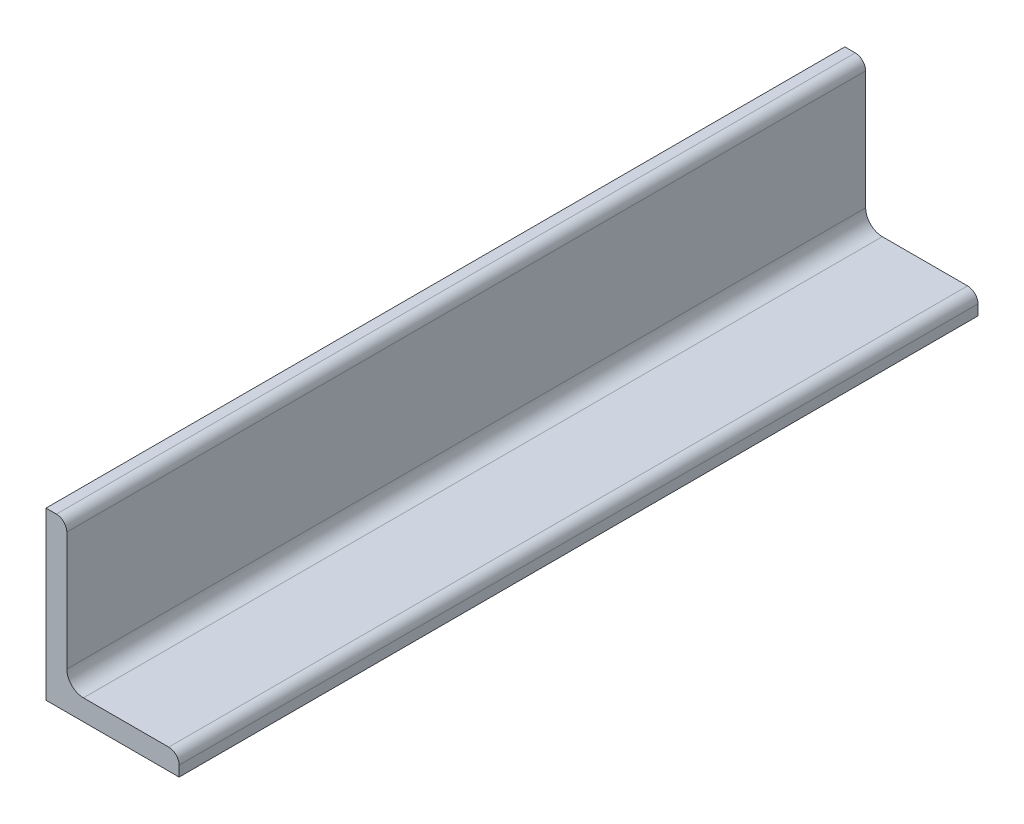
ISO-10303-21;
HEADER;
FILE_DESCRIPTION(('STEP AP214'),'2;1');
FILE_NAME('part.step','',(''),(''),'','','');
FILE_SCHEMA(('AUTOMOTIVE_DESIGN { 1 0 10303 214 1 1 1 1 }'));
ENDSEC;
DATA;
#1=APPLICATION_CONTEXT('core data for automotive mechanical design processes');
#2=APPLICATION_PROTOCOL_DEFINITION('international standard','automotive_design',2000,#1);
#3=PRODUCT_CONTEXT('',#1,'mechanical');
#4=PRODUCT('Part','Part','',(#3));
#5=PRODUCT_RELATED_PRODUCT_CATEGORY('part','',(#4));
#6=PRODUCT_DEFINITION_FORMATION('','',#4);
#7=PRODUCT_DEFINITION_CONTEXT('part definition',#1,'design');
#8=PRODUCT_DEFINITION('design','',#6,#7);
#9=PRODUCT_DEFINITION_SHAPE('','',#8);
#10=(LENGTH_UNIT() NAMED_UNIT(*) SI_UNIT(.MILLI.,.METRE.));
#11=(NAMED_UNIT(*) PLANE_ANGLE_UNIT() SI_UNIT($,.RADIAN.));
#12=(NAMED_UNIT(*) SI_UNIT($,.STERADIAN.) SOLID_ANGLE_UNIT());
#13=UNCERTAINTY_MEASURE_WITH_UNIT(LENGTH_MEASURE(1.E-05),#10,'distance_accuracy_value','');
#14=(GEOMETRIC_REPRESENTATION_CONTEXT(3) GLOBAL_UNCERTAINTY_ASSIGNED_CONTEXT((#13)) GLOBAL_UNIT_ASSIGNED_CONTEXT((#10,
#11,#12)) REPRESENTATION_CONTEXT('',''));
#15=CARTESIAN_POINT('',(0.,0.,0.));
#16=DIRECTION('',(0.,0.,1.));
#17=DIRECTION('',(1.,0.,0.));
#18=AXIS2_PLACEMENT_3D('',#15,#16,#17);
#19=CARTESIAN_POINT('',(0.116507760447575,63.8534276781816,304.8));
#20=DIRECTION('',(1.,0.,0.));
#21=DIRECTION('',(0.,0.,-1.));
#22=AXIS2_PLACEMENT_3D('',#19,#20,#21);
#23=PLANE('',#22);
#24=DIRECTION('',(0.,-1.,0.));
#25=VECTOR('',#24,1.);
#26=CARTESIAN_POINT('',(0.116507760447575,63.8534276781816,0.));
#27=LINE('',#26,#25);
#28=CARTESIAN_POINT('',(0.116507760447575,63.8534276781816,0.));
#29=VERTEX_POINT('',#28);
#30=CARTESIAN_POINT('',(0.116507760447575,0.353427678181561,0.));
#31=VERTEX_POINT('',#30);
#32=EDGE_CURVE('E135',#29,#31,#27,.T.);
#33=ORIENTED_EDGE('',*,*,#32,.T.);
#34=DIRECTION('',(0.,0.,-1.));
#35=VECTOR('',#34,1.);
#36=CARTESIAN_POINT('',(0.116507760447575,0.353427678181561,304.8));
#37=LINE('',#36,#35);
#38=CARTESIAN_POINT('',(0.116507760447575,0.353427678181561,304.8));
#39=VERTEX_POINT('',#38);
#40=EDGE_CURVE('E11',#39,#31,#37,.T.);
#41=ORIENTED_EDGE('',*,*,#40,.F.);
#42=DIRECTION('',(0.,-1.,0.));
#43=VECTOR('',#42,1.);
#44=CARTESIAN_POINT('',(0.116507760447575,63.8534276781816,304.8));
#45=LINE('',#44,#43);
#46=CARTESIAN_POINT('',(0.116507760447575,63.8534276781816,304.8));
#47=VERTEX_POINT('',#46);
#48=EDGE_CURVE('E151',#47,#39,#45,.T.);
#49=ORIENTED_EDGE('',*,*,#48,.F.);
#50=DIRECTION('',(0.,0.,-1.));
#51=VECTOR('',#50,1.);
#52=CARTESIAN_POINT('',(0.116507760447575,63.8534276781816,304.8));
#53=LINE('',#52,#51);
#54=EDGE_CURVE('E131',#47,#29,#53,.T.);
#55=ORIENTED_EDGE('',*,*,#54,.T.);
#56=EDGE_LOOP('',(#33,#41,#49,#55));
#57=FACE_BOUND('',#56,.T.);
#58=ADVANCED_FACE('F33',(#57),#23,.F.);
#59=CARTESIAN_POINT('',(0.116507760447575,0.353427678181561,304.8));
#60=DIRECTION('',(0.,1.,0.));
#61=DIRECTION('',(0.,0.,1.));
#62=AXIS2_PLACEMENT_3D('',#59,#60,#61);
#63=PLANE('',#62);
#64=DIRECTION('',(1.,0.,0.));
#65=VECTOR('',#64,1.);
#66=CARTESIAN_POINT('',(0.116507760447575,0.353427678181561,0.));
#67=LINE('',#66,#65);
#68=CARTESIAN_POINT('',(50.9165077604476,0.353427678181561,0.));
#69=VERTEX_POINT('',#68);
#70=EDGE_CURVE('E138',#31,#69,#67,.T.);
#71=ORIENTED_EDGE('',*,*,#70,.T.);
#72=DIRECTION('',(0.,0.,-1.));
#73=VECTOR('',#72,1.);
#74=CARTESIAN_POINT('',(50.9165077604476,0.353427678181561,304.8));
#75=LINE('',#74,#73);
#76=CARTESIAN_POINT('',(50.9165077604476,0.353427678181561,304.8));
#77=VERTEX_POINT('',#76);
#78=EDGE_CURVE('E41',#77,#69,#75,.T.);
#79=ORIENTED_EDGE('',*,*,#78,.F.);
#80=DIRECTION('',(1.,0.,0.));
#81=VECTOR('',#80,1.);
#82=CARTESIAN_POINT('',(0.116507760447575,0.353427678181561,304.8));
#83=LINE('',#82,#81);
#84=EDGE_CURVE('E95',#39,#77,#83,.T.);
#85=ORIENTED_EDGE('',*,*,#84,.F.);
#86=ORIENTED_EDGE('',*,*,#40,.T.);
#87=EDGE_LOOP('',(#71,#79,#85,#86));
#88=FACE_BOUND('',#87,.T.);
#89=ADVANCED_FACE('F194',(#88),#63,.F.);
#90=CARTESIAN_POINT('',(50.9165077604476,0.353427678181561,304.8));
#91=DIRECTION('',(-1.,0.,0.));
#92=DIRECTION('',(0.,0.,1.));
#93=AXIS2_PLACEMENT_3D('',#90,#91,#92);
#94=PLANE('',#93);
#95=DIRECTION('',(0.,1.,0.));
#96=VECTOR('',#95,1.);
#97=CARTESIAN_POINT('',(50.9165077604476,0.353427678181561,0.));
#98=LINE('',#97,#96);
#99=CARTESIAN_POINT('',(50.9165077604476,4.32217767818156,0.));
#100=VERTEX_POINT('',#99);
#101=EDGE_CURVE('E140',#69,#100,#98,.T.);
#102=ORIENTED_EDGE('',*,*,#101,.T.);
#103=DIRECTION('',(0.,0.,-1.));
#104=VECTOR('',#103,1.);
#105=CARTESIAN_POINT('',(50.9165077604476,4.32217767818156,304.8));
#106=LINE('',#105,#104);
#107=CARTESIAN_POINT('',(50.9165077604476,4.32217767818156,304.8));
#108=VERTEX_POINT('',#107);
#109=EDGE_CURVE('E161',#108,#100,#106,.T.);
#110=ORIENTED_EDGE('',*,*,#109,.F.);
#111=DIRECTION('',(0.,1.,0.));
#112=VECTOR('',#111,1.);
#113=CARTESIAN_POINT('',(50.9165077604476,0.353427678181561,304.8));
#114=LINE('',#113,#112);
#115=EDGE_CURVE('E169',#77,#108,#114,.T.);
#116=ORIENTED_EDGE('',*,*,#115,.F.);
#117=ORIENTED_EDGE('',*,*,#78,.T.);
#118=EDGE_LOOP('',(#102,#110,#116,#117));
#119=FACE_BOUND('',#118,.T.);
#120=ADVANCED_FACE('F167',(#119),#94,.F.);
#121=CARTESIAN_POINT('',(46.9477577604476,4.32217767818156,304.8));
#122=DIRECTION('',(0.,0.,-1.));
#123=DIRECTION('',(-1.,0.,0.));
#124=AXIS2_PLACEMENT_3D('',#121,#122,#123);
#125=CYLINDRICAL_SURFACE('',#124,3.96875);
#126=CARTESIAN_POINT('',(46.9477577604476,4.32217767818156,0.));
#127=DIRECTION('',(0.,0.,1.));
#128=DIRECTION('',(1.,0.,0.));
#129=AXIS2_PLACEMENT_3D('',#126,#127,#128);
#130=CIRCLE('',#129,3.96875);
#131=CARTESIAN_POINT('',(46.9477577604476,8.29092767818156,0.));
#132=VERTEX_POINT('',#131);
#133=EDGE_CURVE('E142',#100,#132,#130,.T.);
#134=ORIENTED_EDGE('',*,*,#133,.T.);
#135=DIRECTION('',(0.,0.,-1.));
#136=VECTOR('',#135,1.);
#137=CARTESIAN_POINT('',(46.9477577604476,8.29092767818156,304.8));
#138=LINE('',#137,#136);
#139=CARTESIAN_POINT('',(46.9477577604476,8.29092767818156,304.8));
#140=VERTEX_POINT('',#139);
#141=EDGE_CURVE('E158',#140,#132,#138,.T.);
#142=ORIENTED_EDGE('',*,*,#141,.F.);
#143=CARTESIAN_POINT('',(46.9477577604476,4.32217767818156,304.8));
#144=DIRECTION('',(0.,0.,1.));
#145=DIRECTION('',(1.,0.,0.));
#146=AXIS2_PLACEMENT_3D('',#143,#144,#145);
#147=CIRCLE('',#146,3.96875);
#148=EDGE_CURVE('E185',#108,#140,#147,.T.);
#149=ORIENTED_EDGE('',*,*,#148,.F.);
#150=ORIENTED_EDGE('',*,*,#109,.T.);
#151=EDGE_LOOP('',(#134,#142,#149,#150));
#152=FACE_BOUND('',#151,.T.);
#153=ADVANCED_FACE('F178',(#152),#125,.T.);
#154=CARTESIAN_POINT('',(46.9477577604476,8.29092767818156,304.8));
#155=DIRECTION('',(0.,-1.,0.));
#156=DIRECTION('',(0.,0.,-1.));
#157=AXIS2_PLACEMENT_3D('',#154,#155,#156);
#158=PLANE('',#157);
#159=DIRECTION('',(-1.,0.,0.));
#160=VECTOR('',#159,1.);
#161=CARTESIAN_POINT('',(46.9477577604476,8.29092767818156,0.));
#162=LINE('',#161,#160);
#163=CARTESIAN_POINT('',(14.4040077604476,8.29092767818156,0.));
#164=VERTEX_POINT('',#163);
#165=EDGE_CURVE('E144',#132,#164,#162,.T.);
#166=ORIENTED_EDGE('',*,*,#165,.T.);
#167=DIRECTION('',(0.,0.,-1.));
#168=VECTOR('',#167,1.);
#169=CARTESIAN_POINT('',(14.4040077604476,8.29092767818156,304.8));
#170=LINE('',#169,#168);
#171=CARTESIAN_POINT('',(14.4040077604476,8.29092767818156,304.8));
#172=VERTEX_POINT('',#171);
#173=EDGE_CURVE('E155',#172,#164,#170,.T.);
#174=ORIENTED_EDGE('',*,*,#173,.F.);
#175=DIRECTION('',(-1.,0.,0.));
#176=VECTOR('',#175,1.);
#177=CARTESIAN_POINT('',(46.9477577604476,8.29092767818156,304.8));
#178=LINE('',#177,#176);
#179=EDGE_CURVE('E184',#140,#172,#178,.T.);
#180=ORIENTED_EDGE('',*,*,#179,.F.);
#181=ORIENTED_EDGE('',*,*,#141,.T.);
#182=EDGE_LOOP('',(#166,#174,#180,#181));
#183=FACE_BOUND('',#182,.T.);
#184=ADVANCED_FACE('F182',(#183),#158,.F.);
#185=CARTESIAN_POINT('',(14.4040077604476,14.6409276781816,304.8));
#186=DIRECTION('',(0.,0.,-1.));
#187=DIRECTION('',(-1.,0.,0.));
#188=AXIS2_PLACEMENT_3D('',#185,#186,#187);
#189=CYLINDRICAL_SURFACE('',#188,6.34999999999999);
#190=CARTESIAN_POINT('',(14.4040077604476,14.6409276781816,0.));
#191=DIRECTION('',(0.,0.,-1.));
#192=DIRECTION('',(1.,0.,0.));
#193=AXIS2_PLACEMENT_3D('',#190,#191,#192);
#194=CIRCLE('',#193,6.34999999999999);
#195=CARTESIAN_POINT('',(8.05400776044758,14.6409276781816,0.));
#196=VERTEX_POINT('',#195);
#197=EDGE_CURVE('E146',#164,#196,#194,.T.);
#198=ORIENTED_EDGE('',*,*,#197,.T.);
#199=DIRECTION('',(0.,0.,-1.));
#200=VECTOR('',#199,1.);
#201=CARTESIAN_POINT('',(8.05400776044758,14.6409276781816,304.8));
#202=LINE('',#201,#200);
#203=CARTESIAN_POINT('',(8.05400776044758,14.6409276781816,304.8));
#204=VERTEX_POINT('',#203);
#205=EDGE_CURVE('E126',#204,#196,#202,.T.);
#206=ORIENTED_EDGE('',*,*,#205,.F.);
#207=CARTESIAN_POINT('',(14.4040077604476,14.6409276781816,304.8));
#208=DIRECTION('',(0.,0.,-1.));
#209=DIRECTION('',(1.,0.,0.));
#210=AXIS2_PLACEMENT_3D('',#207,#208,#209);
#211=CIRCLE('',#210,6.34999999999999);
#212=EDGE_CURVE('E117',#172,#204,#211,.T.);
#213=ORIENTED_EDGE('',*,*,#212,.F.);
#214=ORIENTED_EDGE('',*,*,#173,.T.);
#215=EDGE_LOOP('',(#198,#206,#213,#214));
#216=FACE_BOUND('',#215,.T.);
#217=ADVANCED_FACE('F206',(#216),#189,.F.);
#218=CARTESIAN_POINT('',(8.05400776044758,14.6409276781816,304.8));
#219=DIRECTION('',(-1.,0.,0.));
#220=DIRECTION('',(0.,0.,1.));
#221=AXIS2_PLACEMENT_3D('',#218,#219,#220);
#222=PLANE('',#221);
#223=DIRECTION('',(0.,1.,0.));
#224=VECTOR('',#223,1.);
#225=CARTESIAN_POINT('',(8.05400776044758,14.6409276781816,0.));
#226=LINE('',#225,#224);
#227=CARTESIAN_POINT('',(8.05400776044758,59.8846776781816,0.));
#228=VERTEX_POINT('',#227);
#229=EDGE_CURVE('E125',#196,#228,#226,.T.);
#230=ORIENTED_EDGE('',*,*,#229,.T.);
#231=DIRECTION('',(0.,0.,-1.));
#232=VECTOR('',#231,1.);
#233=CARTESIAN_POINT('',(8.05400776044758,59.8846776781816,304.8));
#234=LINE('',#233,#232);
#235=CARTESIAN_POINT('',(8.05400776044758,59.8846776781816,304.8));
#236=VERTEX_POINT('',#235);
#237=EDGE_CURVE('E122',#236,#228,#234,.T.);
#238=ORIENTED_EDGE('',*,*,#237,.F.);
#239=DIRECTION('',(0.,1.,0.));
#240=VECTOR('',#239,1.);
#241=CARTESIAN_POINT('',(8.05400776044758,14.6409276781816,304.8));
#242=LINE('',#241,#240);
#243=EDGE_CURVE('E111',#204,#236,#242,.T.);
#244=ORIENTED_EDGE('',*,*,#243,.F.);
#245=ORIENTED_EDGE('',*,*,#205,.T.);
#246=EDGE_LOOP('',(#230,#238,#244,#245));
#247=FACE_BOUND('',#246,.T.);
#248=ADVANCED_FACE('F123',(#247),#222,.F.);
#249=CARTESIAN_POINT('',(4.08525776044757,59.8846776781816,304.8));
#250=DIRECTION('',(0.,0.,-1.));
#251=DIRECTION('',(-1.,0.,0.));
#252=AXIS2_PLACEMENT_3D('',#249,#250,#251);
#253=CYLINDRICAL_SURFACE('',#252,3.96875);
#254=CARTESIAN_POINT('',(4.08525776044757,59.8846776781816,0.));
#255=DIRECTION('',(0.,0.,1.));
#256=DIRECTION('',(1.,0.,0.));
#257=AXIS2_PLACEMENT_3D('',#254,#255,#256);
#258=CIRCLE('',#257,3.96875);
#259=CARTESIAN_POINT('',(4.08525776044758,63.8534276781816,0.));
#260=VERTEX_POINT('',#259);
#261=EDGE_CURVE('E81',#228,#260,#258,.T.);
#262=ORIENTED_EDGE('',*,*,#261,.T.);
#263=DIRECTION('',(0.,0.,-1.));
#264=VECTOR('',#263,1.);
#265=CARTESIAN_POINT('',(4.08525776044758,63.8534276781816,304.8));
#266=LINE('',#265,#264);
#267=CARTESIAN_POINT('',(4.08525776044758,63.8534276781816,304.8));
#268=VERTEX_POINT('',#267);
#269=EDGE_CURVE('E127',#268,#260,#266,.T.);
#270=ORIENTED_EDGE('',*,*,#269,.F.);
#271=CARTESIAN_POINT('',(4.08525776044757,59.8846776781816,304.8));
#272=DIRECTION('',(0.,0.,1.));
#273=DIRECTION('',(1.,0.,0.));
#274=AXIS2_PLACEMENT_3D('',#271,#272,#273);
#275=CIRCLE('',#274,3.96875);
#276=EDGE_CURVE('E115',#236,#268,#275,.T.);
#277=ORIENTED_EDGE('',*,*,#276,.F.);
#278=ORIENTED_EDGE('',*,*,#237,.T.);
#279=EDGE_LOOP('',(#262,#270,#277,#278));
#280=FACE_BOUND('',#279,.T.);
#281=ADVANCED_FACE('F129',(#280),#253,.T.);
#282=CARTESIAN_POINT('',(4.08525776044758,63.8534276781816,304.8));
#283=DIRECTION('',(0.,-1.,0.));
#284=DIRECTION('',(0.,0.,-1.));
#285=AXIS2_PLACEMENT_3D('',#282,#283,#284);
#286=PLANE('',#285);
#287=DIRECTION('',(-1.,0.,0.));
#288=VECTOR('',#287,1.);
#289=CARTESIAN_POINT('',(4.08525776044758,63.8534276781816,0.));
#290=LINE('',#289,#288);
#291=EDGE_CURVE('E87',#260,#29,#290,.T.);
#292=ORIENTED_EDGE('',*,*,#291,.T.);
#293=ORIENTED_EDGE('',*,*,#54,.F.);
#294=DIRECTION('',(-1.,0.,0.));
#295=VECTOR('',#294,1.);
#296=CARTESIAN_POINT('',(4.08525776044758,63.8534276781816,304.8));
#297=LINE('',#296,#295);
#298=EDGE_CURVE('E49',#268,#47,#297,.T.);
#299=ORIENTED_EDGE('',*,*,#298,.F.);
#300=ORIENTED_EDGE('',*,*,#269,.T.);
#301=EDGE_LOOP('',(#292,#293,#299,#300));
#302=FACE_BOUND('',#301,.T.);
#303=ADVANCED_FACE('F214',(#302),#286,.F.);
#304=CARTESIAN_POINT('',(46.9477577604476,4.32217767818156,304.8));
#305=DIRECTION('',(0.,0.,1.));
#306=DIRECTION('',(1.,0.,0.));
#307=AXIS2_PLACEMENT_3D('',#304,#305,#306);
#308=PLANE('',#307);
#309=ORIENTED_EDGE('',*,*,#48,.T.);
#310=ORIENTED_EDGE('',*,*,#84,.T.);
#311=ORIENTED_EDGE('',*,*,#115,.T.);
#312=ORIENTED_EDGE('',*,*,#148,.T.);
#313=ORIENTED_EDGE('',*,*,#179,.T.);
#314=ORIENTED_EDGE('',*,*,#212,.T.);
#315=ORIENTED_EDGE('',*,*,#243,.T.);
#316=ORIENTED_EDGE('',*,*,#276,.T.);
#317=ORIENTED_EDGE('',*,*,#298,.T.);
#318=EDGE_LOOP('',(#309,#310,#311,#312,#313,#314,#315,#316,#317));
#319=FACE_BOUND('',#318,.T.);
#320=ADVANCED_FACE('F113',(#319),#308,.T.);
#321=CARTESIAN_POINT('',(46.9477577604476,4.32217767818156,0.));
#322=DIRECTION('',(0.,0.,1.));
#323=DIRECTION('',(1.,0.,0.));
#324=AXIS2_PLACEMENT_3D('',#321,#322,#323);
#325=PLANE('',#324);
#326=ORIENTED_EDGE('',*,*,#32,.F.);
#327=ORIENTED_EDGE('',*,*,#291,.F.);
#328=ORIENTED_EDGE('',*,*,#261,.F.);
#329=ORIENTED_EDGE('',*,*,#229,.F.);
#330=ORIENTED_EDGE('',*,*,#197,.F.);
#331=ORIENTED_EDGE('',*,*,#165,.F.);
#332=ORIENTED_EDGE('',*,*,#133,.F.);
#333=ORIENTED_EDGE('',*,*,#101,.F.);
#334=ORIENTED_EDGE('',*,*,#70,.F.);
#335=EDGE_LOOP('',(#326,#327,#328,#329,#330,#331,#332,#333,#334));
#336=FACE_BOUND('',#335,.T.);
#337=ADVANCED_FACE('F173',(#336),#325,.F.);
#338=CLOSED_SHELL('',(#58,#89,#120,#153,#184,#217,#248,#281,#303,#320,#337));
#339=MANIFOLD_SOLID_BREP('B2',#338);
#340=ADVANCED_BREP_SHAPE_REPRESENTATION('',(#18,#339),#14);
#341=SHAPE_DEFINITION_REPRESENTATION(#9,#340);
ENDSEC;
END-ISO-10303-21;
